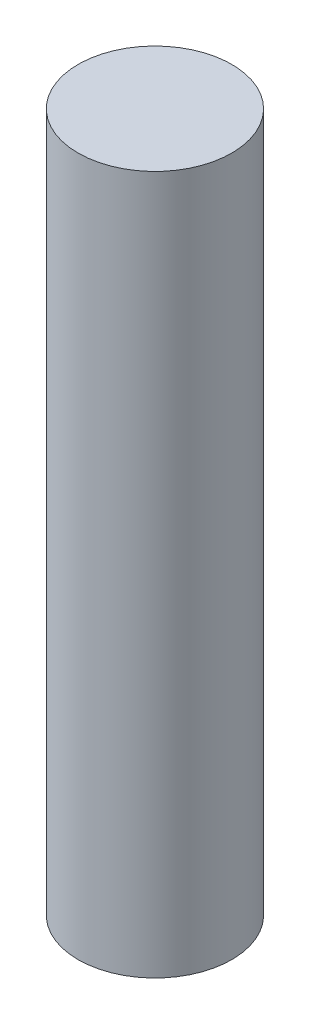
ISO-10303-21;
HEADER;
FILE_DESCRIPTION(('STEP AP214'),'2;1');
FILE_NAME('part.step','',(''),(''),'','','');
FILE_SCHEMA(('AUTOMOTIVE_DESIGN { 1 0 10303 214 1 1 1 1 }'));
ENDSEC;
DATA;
#1=APPLICATION_CONTEXT('core data for automotive mechanical design processes');
#2=APPLICATION_PROTOCOL_DEFINITION('international standard','automotive_design',2000,#1);
#3=PRODUCT_CONTEXT('',#1,'mechanical');
#4=PRODUCT('Part','Part','',(#3));
#5=PRODUCT_RELATED_PRODUCT_CATEGORY('part','',(#4));
#6=PRODUCT_DEFINITION_FORMATION('','',#4);
#7=PRODUCT_DEFINITION_CONTEXT('part definition',#1,'design');
#8=PRODUCT_DEFINITION('design','',#6,#7);
#9=PRODUCT_DEFINITION_SHAPE('','',#8);
#10=(LENGTH_UNIT() NAMED_UNIT(*) SI_UNIT(.MILLI.,.METRE.));
#11=(NAMED_UNIT(*) PLANE_ANGLE_UNIT() SI_UNIT($,.RADIAN.));
#12=(NAMED_UNIT(*) SI_UNIT($,.STERADIAN.) SOLID_ANGLE_UNIT());
#13=UNCERTAINTY_MEASURE_WITH_UNIT(LENGTH_MEASURE(1.E-05),#10,'distance_accuracy_value','');
#14=(GEOMETRIC_REPRESENTATION_CONTEXT(3) GLOBAL_UNCERTAINTY_ASSIGNED_CONTEXT((#13)) GLOBAL_UNIT_ASSIGNED_CONTEXT((#10,
#11,#12)) REPRESENTATION_CONTEXT('',''));
#15=CARTESIAN_POINT('',(0.,0.,0.));
#16=DIRECTION('',(0.,0.,1.));
#17=DIRECTION('',(1.,0.,0.));
#18=AXIS2_PLACEMENT_3D('',#15,#16,#17);
#19=CARTESIAN_POINT('',(0.,250.,0.));
#20=DIRECTION('',(0.,-1.,0.));
#21=DIRECTION('',(0.,0.,-1.));
#22=AXIS2_PLACEMENT_3D('',#19,#20,#21);
#23=CYLINDRICAL_SURFACE('',#22,27.5);
#24=CARTESIAN_POINT('',(0.,250.,0.));
#25=DIRECTION('',(0.,1.,0.));
#26=DIRECTION('',(0.,0.,1.));
#27=AXIS2_PLACEMENT_3D('',#24,#25,#26);
#28=CIRCLE('',#27,27.5);
#29=CARTESIAN_POINT('',(0.,250.,27.5));
#30=VERTEX_POINT('',#29);
#31=EDGE_CURVE('E10',#30,#30,#28,.T.);
#32=ORIENTED_EDGE('',*,*,#31,.F.);
#33=EDGE_LOOP('',(#32));
#34=FACE_BOUND('',#33,.T.);
#35=CARTESIAN_POINT('',(0.,0.,0.));
#36=DIRECTION('',(0.,1.,0.));
#37=DIRECTION('',(0.,0.,1.));
#38=AXIS2_PLACEMENT_3D('',#35,#36,#37);
#39=CIRCLE('',#38,27.5);
#40=CARTESIAN_POINT('',(0.,0.,27.5));
#41=VERTEX_POINT('',#40);
#42=EDGE_CURVE('E40',#41,#41,#39,.T.);
#43=ORIENTED_EDGE('',*,*,#42,.T.);
#44=EDGE_LOOP('',(#43));
#45=FACE_BOUND('',#44,.T.);
#46=ADVANCED_FACE('F37',(#34,#45),#23,.T.);
#47=CARTESIAN_POINT('',(0.,250.,0.));
#48=DIRECTION('',(0.,1.,0.));
#49=DIRECTION('',(0.,0.,1.));
#50=AXIS2_PLACEMENT_3D('',#47,#48,#49);
#51=PLANE('',#50);
#52=ORIENTED_EDGE('',*,*,#31,.T.);
#53=EDGE_LOOP('',(#52));
#54=FACE_BOUND('',#53,.T.);
#55=ADVANCED_FACE('F54',(#54),#51,.T.);
#56=CARTESIAN_POINT('',(0.,0.,0.));
#57=DIRECTION('',(0.,1.,0.));
#58=DIRECTION('',(0.,0.,1.));
#59=AXIS2_PLACEMENT_3D('',#56,#57,#58);
#60=PLANE('',#59);
#61=ORIENTED_EDGE('',*,*,#42,.F.);
#62=EDGE_LOOP('',(#61));
#63=FACE_BOUND('',#62,.T.);
#64=ADVANCED_FACE('F52',(#63),#60,.F.);
#65=CLOSED_SHELL('',(#46,#55,#64));
#66=MANIFOLD_SOLID_BREP('B2',#65);
#67=ADVANCED_BREP_SHAPE_REPRESENTATION('',(#18,#66),#14);
#68=SHAPE_DEFINITION_REPRESENTATION(#9,#67);
ENDSEC;
END-ISO-10303-21;
